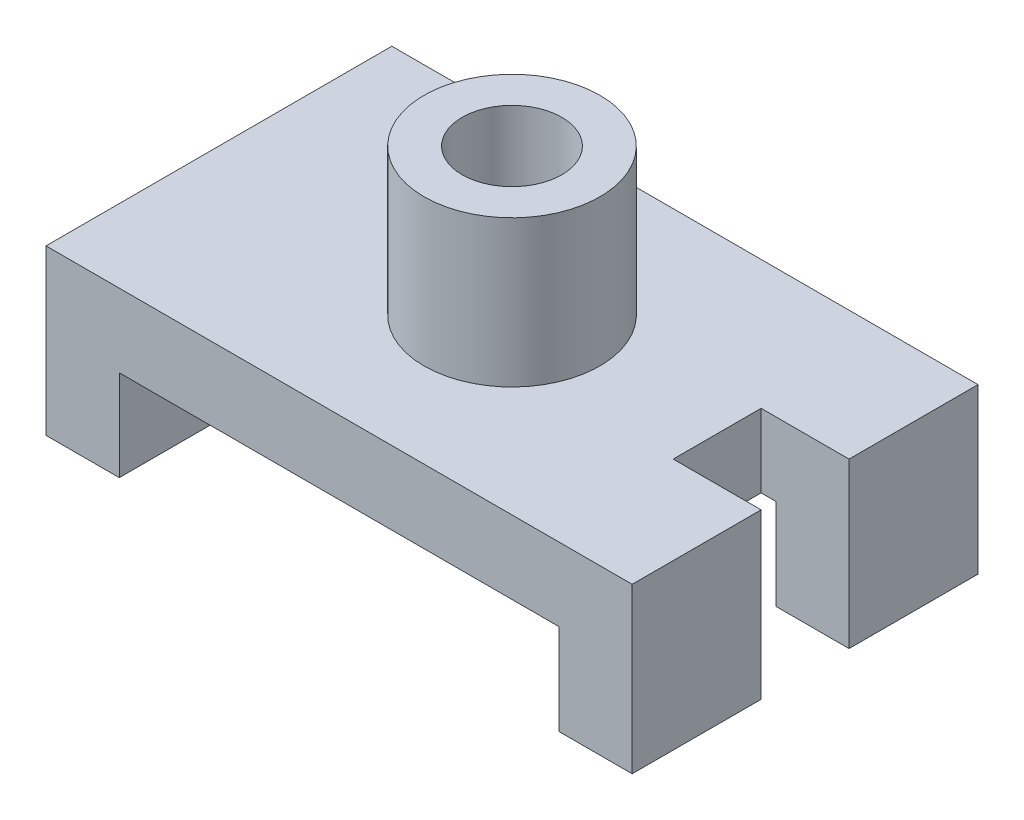
ISO-10303-21;
HEADER;
FILE_DESCRIPTION(('STEP AP214'),'2;1');
FILE_NAME('part.step','',(''),(''),'','','');
FILE_SCHEMA(('AUTOMOTIVE_DESIGN { 1 0 10303 214 1 1 1 1 }'));
ENDSEC;
DATA;
#1=APPLICATION_CONTEXT('core data for automotive mechanical design processes');
#2=APPLICATION_PROTOCOL_DEFINITION('international standard','automotive_design',2000,#1);
#3=PRODUCT_CONTEXT('',#1,'mechanical');
#4=PRODUCT('Part','Part','',(#3));
#5=PRODUCT_RELATED_PRODUCT_CATEGORY('part','',(#4));
#6=PRODUCT_DEFINITION_FORMATION('','',#4);
#7=PRODUCT_DEFINITION_CONTEXT('part definition',#1,'design');
#8=PRODUCT_DEFINITION('design','',#6,#7);
#9=PRODUCT_DEFINITION_SHAPE('','',#8);
#10=(LENGTH_UNIT() NAMED_UNIT(*) SI_UNIT(.MILLI.,.METRE.));
#11=(NAMED_UNIT(*) PLANE_ANGLE_UNIT() SI_UNIT($,.RADIAN.));
#12=(NAMED_UNIT(*) SI_UNIT($,.STERADIAN.) SOLID_ANGLE_UNIT());
#13=UNCERTAINTY_MEASURE_WITH_UNIT(LENGTH_MEASURE(1.E-05),#10,'distance_accuracy_value','');
#14=(GEOMETRIC_REPRESENTATION_CONTEXT(3) GLOBAL_UNCERTAINTY_ASSIGNED_CONTEXT((#13)) GLOBAL_UNIT_ASSIGNED_CONTEXT((#10,
#11,#12)) REPRESENTATION_CONTEXT('',''));
#15=CARTESIAN_POINT('',(0.,0.,0.));
#16=DIRECTION('',(0.,0.,1.));
#17=DIRECTION('',(1.,0.,0.));
#18=AXIS2_PLACEMENT_3D('',#15,#16,#17);
#19=CARTESIAN_POINT('',(0.,0.,1.18));
#20=DIRECTION('',(-1.,0.,0.));
#21=DIRECTION('',(0.,0.,1.));
#22=AXIS2_PLACEMENT_3D('',#19,#20,#21);
#23=PLANE('',#22);
#24=DIRECTION('',(0.,0.,-1.));
#25=VECTOR('',#24,1.);
#26=CARTESIAN_POINT('',(0.,0.,1.18));
#27=LINE('',#26,#25);
#28=CARTESIAN_POINT('',(0.,0.,1.18));
#29=VERTEX_POINT('',#28);
#30=CARTESIAN_POINT('',(0.,0.,0.3));
#31=VERTEX_POINT('',#30);
#32=EDGE_CURVE('E168',#29,#31,#27,.T.);
#33=ORIENTED_EDGE('',*,*,#32,.T.);
#34=DIRECTION('',(0.,1.,0.));
#35=VECTOR('',#34,1.);
#36=CARTESIAN_POINT('',(0.,0.,0.3));
#37=LINE('',#36,#35);
#38=CARTESIAN_POINT('',(0.,1.12,0.3));
#39=VERTEX_POINT('',#38);
#40=EDGE_CURVE('E217',#31,#39,#37,.T.);
#41=ORIENTED_EDGE('',*,*,#40,.T.);
#42=DIRECTION('',(0.,0.,-1.));
#43=VECTOR('',#42,1.);
#44=CARTESIAN_POINT('',(0.,1.12,1.18));
#45=LINE('',#44,#43);
#46=CARTESIAN_POINT('',(0.,1.12,1.18));
#47=VERTEX_POINT('',#46);
#48=EDGE_CURVE('E184',#47,#39,#45,.T.);
#49=ORIENTED_EDGE('',*,*,#48,.F.);
#50=DIRECTION('',(0.,1.,0.));
#51=VECTOR('',#50,1.);
#52=CARTESIAN_POINT('',(0.,0.,1.18));
#53=LINE('',#52,#51);
#54=EDGE_CURVE('E167',#29,#47,#53,.T.);
#55=ORIENTED_EDGE('',*,*,#54,.F.);
#56=EDGE_LOOP('',(#33,#41,#49,#55));
#57=FACE_BOUND('',#56,.T.);
#58=ADVANCED_FACE('F36',(#57),#23,.F.);
#59=CARTESIAN_POINT('',(-0.5,0.,1.18));
#60=DIRECTION('',(1.,0.,0.));
#61=DIRECTION('',(0.,1.,0.));
#62=AXIS2_PLACEMENT_3D('',#59,#60,#61);
#63=PLANE('',#62);
#64=DIRECTION('',(0.,0.,-1.));
#65=VECTOR('',#64,1.);
#66=CARTESIAN_POINT('',(-0.5,0.62,1.18));
#67=LINE('',#66,#65);
#68=CARTESIAN_POINT('',(-0.5,0.62,1.18));
#69=VERTEX_POINT('',#68);
#70=CARTESIAN_POINT('',(-0.5,0.62,0.3));
#71=VERTEX_POINT('',#70);
#72=EDGE_CURVE('E132',#69,#71,#67,.T.);
#73=ORIENTED_EDGE('',*,*,#72,.T.);
#74=DIRECTION('',(0.,-1.,0.));
#75=VECTOR('',#74,1.);
#76=CARTESIAN_POINT('',(-0.5,0.,0.3));
#77=LINE('',#76,#75);
#78=CARTESIAN_POINT('',(-0.5,0.,0.3));
#79=VERTEX_POINT('',#78);
#80=EDGE_CURVE('E225',#71,#79,#77,.T.);
#81=ORIENTED_EDGE('',*,*,#80,.T.);
#82=DIRECTION('',(0.,0.,-1.));
#83=VECTOR('',#82,1.);
#84=CARTESIAN_POINT('',(-0.5,0.,1.18));
#85=LINE('',#84,#83);
#86=CARTESIAN_POINT('',(-0.5,0.,1.18));
#87=VERTEX_POINT('',#86);
#88=EDGE_CURVE('E144',#87,#79,#85,.T.);
#89=ORIENTED_EDGE('',*,*,#88,.F.);
#90=DIRECTION('',(0.,-1.,0.));
#91=VECTOR('',#90,1.);
#92=CARTESIAN_POINT('',(-0.5,0.,1.18));
#93=LINE('',#92,#91);
#94=EDGE_CURVE('E122',#69,#87,#93,.T.);
#95=ORIENTED_EDGE('',*,*,#94,.F.);
#96=EDGE_LOOP('',(#73,#81,#89,#95));
#97=FACE_BOUND('',#96,.T.);
#98=ADVANCED_FACE('F142',(#97),#63,.F.);
#99=CARTESIAN_POINT('',(0.,0.,1.18));
#100=DIRECTION('',(0.,1.,0.));
#101=DIRECTION('',(0.,0.,1.));
#102=AXIS2_PLACEMENT_3D('',#99,#100,#101);
#103=PLANE('',#102);
#104=ORIENTED_EDGE('',*,*,#88,.T.);
#105=DIRECTION('',(1.,0.,0.));
#106=VECTOR('',#105,1.);
#107=CARTESIAN_POINT('',(0.,0.,0.3));
#108=LINE('',#107,#106);
#109=EDGE_CURVE('E186',#79,#31,#108,.T.);
#110=ORIENTED_EDGE('',*,*,#109,.T.);
#111=ORIENTED_EDGE('',*,*,#32,.F.);
#112=DIRECTION('',(1.,0.,0.));
#113=VECTOR('',#112,1.);
#114=CARTESIAN_POINT('',(0.,0.,1.18));
#115=LINE('',#114,#113);
#116=EDGE_CURVE('E60',#87,#29,#115,.T.);
#117=ORIENTED_EDGE('',*,*,#116,.F.);
#118=EDGE_LOOP('',(#104,#110,#111,#117));
#119=FACE_BOUND('',#118,.T.);
#120=ADVANCED_FACE('F260',(#119),#103,.F.);
#121=CARTESIAN_POINT('',(0.,1.12,-0.3));
#122=VERTEX_POINT('',#121);
#123=CARTESIAN_POINT('',(0.,1.12,-1.18));
#124=VERTEX_POINT('',#123);
#125=EDGE_CURVE('E183',#122,#124,#45,.T.);
#126=ORIENTED_EDGE('',*,*,#125,.F.);
#127=DIRECTION('',(0.,1.,0.));
#128=VECTOR('',#127,1.);
#129=CARTESIAN_POINT('',(0.,0.,-0.3));
#130=LINE('',#129,#128);
#131=CARTESIAN_POINT('',(0.,0.,-0.3));
#132=VERTEX_POINT('',#131);
#133=EDGE_CURVE('E215',#132,#122,#130,.T.);
#134=ORIENTED_EDGE('',*,*,#133,.F.);
#135=CARTESIAN_POINT('',(0.,0.,-1.18));
#136=VERTEX_POINT('',#135);
#137=EDGE_CURVE('E94',#132,#136,#27,.T.);
#138=ORIENTED_EDGE('',*,*,#137,.T.);
#139=DIRECTION('',(0.,1.,0.));
#140=VECTOR('',#139,1.);
#141=CARTESIAN_POINT('',(0.,0.,-1.18));
#142=LINE('',#141,#140);
#143=EDGE_CURVE('E149',#136,#124,#142,.T.);
#144=ORIENTED_EDGE('',*,*,#143,.T.);
#145=EDGE_LOOP('',(#126,#134,#138,#144));
#146=FACE_BOUND('',#145,.T.);
#147=ADVANCED_FACE('F38',(#146),#23,.F.);
#148=CARTESIAN_POINT('',(0.,1.12,1.18));
#149=DIRECTION('',(0.,-1.,0.));
#150=DIRECTION('',(0.,0.,-1.));
#151=AXIS2_PLACEMENT_3D('',#148,#149,#150);
#152=PLANE('',#151);
#153=CARTESIAN_POINT('',(-2.,1.12,0.));
#154=DIRECTION('',(0.,-1.,0.));
#155=DIRECTION('',(0.,0.,-1.));
#156=AXIS2_PLACEMENT_3D('',#153,#154,#155);
#157=CIRCLE('',#156,0.6);
#158=CARTESIAN_POINT('',(-2.,1.12,-0.6));
#159=VERTEX_POINT('',#158);
#160=EDGE_CURVE('E11',#159,#159,#157,.F.);
#161=ORIENTED_EDGE('',*,*,#160,.F.);
#162=EDGE_LOOP('',(#161));
#163=FACE_BOUND('',#162,.T.);
#164=ORIENTED_EDGE('',*,*,#48,.T.);
#165=DIRECTION('',(1.,0.,0.));
#166=VECTOR('',#165,1.);
#167=CARTESIAN_POINT('',(0.,1.12,0.3));
#168=LINE('',#167,#166);
#169=CARTESIAN_POINT('',(-0.6,1.12,0.3));
#170=VERTEX_POINT('',#169);
#171=EDGE_CURVE('E278',#170,#39,#168,.T.);
#172=ORIENTED_EDGE('',*,*,#171,.F.);
#173=DIRECTION('',(0.,0.,1.));
#174=VECTOR('',#173,1.);
#175=CARTESIAN_POINT('',(-0.6,1.12,-0.3));
#176=LINE('',#175,#174);
#177=CARTESIAN_POINT('',(-0.6,1.12,-0.3));
#178=VERTEX_POINT('',#177);
#179=EDGE_CURVE('E275',#178,#170,#176,.T.);
#180=ORIENTED_EDGE('',*,*,#179,.F.);
#181=DIRECTION('',(-1.,0.,0.));
#182=VECTOR('',#181,1.);
#183=CARTESIAN_POINT('',(0.,1.12,-0.3));
#184=LINE('',#183,#182);
#185=EDGE_CURVE('E213',#122,#178,#184,.T.);
#186=ORIENTED_EDGE('',*,*,#185,.F.);
#187=ORIENTED_EDGE('',*,*,#125,.T.);
#188=DIRECTION('',(-1.,0.,0.));
#189=VECTOR('',#188,1.);
#190=CARTESIAN_POINT('',(0.,1.12,-1.18));
#191=LINE('',#190,#189);
#192=CARTESIAN_POINT('',(-4.,1.12,-1.18));
#193=VERTEX_POINT('',#192);
#194=EDGE_CURVE('E151',#124,#193,#191,.T.);
#195=ORIENTED_EDGE('',*,*,#194,.T.);
#196=DIRECTION('',(0.,0.,-1.));
#197=VECTOR('',#196,1.);
#198=CARTESIAN_POINT('',(-4.,1.12,1.18));
#199=LINE('',#198,#197);
#200=CARTESIAN_POINT('',(-4.,1.12,1.18));
#201=VERTEX_POINT('',#200);
#202=EDGE_CURVE('E180',#201,#193,#199,.T.);
#203=ORIENTED_EDGE('',*,*,#202,.F.);
#204=DIRECTION('',(-1.,0.,0.));
#205=VECTOR('',#204,1.);
#206=CARTESIAN_POINT('',(0.,1.12,1.18));
#207=LINE('',#206,#205);
#208=EDGE_CURVE('E103',#47,#201,#207,.T.);
#209=ORIENTED_EDGE('',*,*,#208,.F.);
#210=EDGE_LOOP('',(#164,#172,#180,#186,#187,#195,#203,#209));
#211=FACE_BOUND('',#210,.T.);
#212=ADVANCED_FACE('F265',(#163,#211),#152,.F.);
#213=CARTESIAN_POINT('',(-4.,0.,1.18));
#214=DIRECTION('',(1.,0.,0.));
#215=DIRECTION('',(0.,0.,-1.));
#216=AXIS2_PLACEMENT_3D('',#213,#214,#215);
#217=PLANE('',#216);
#218=DIRECTION('',(0.,-1.,0.));
#219=VECTOR('',#218,1.);
#220=CARTESIAN_POINT('',(-4.,0.,-1.18));
#221=LINE('',#220,#219);
#222=CARTESIAN_POINT('',(-4.,0.,-1.18));
#223=VERTEX_POINT('',#222);
#224=EDGE_CURVE('E153',#193,#223,#221,.T.);
#225=ORIENTED_EDGE('',*,*,#224,.T.);
#226=DIRECTION('',(0.,0.,-1.));
#227=VECTOR('',#226,1.);
#228=CARTESIAN_POINT('',(-4.,0.,1.18));
#229=LINE('',#228,#227);
#230=CARTESIAN_POINT('',(-4.,0.,1.18));
#231=VERTEX_POINT('',#230);
#232=EDGE_CURVE('E177',#231,#223,#229,.T.);
#233=ORIENTED_EDGE('',*,*,#232,.F.);
#234=DIRECTION('',(0.,-1.,0.));
#235=VECTOR('',#234,1.);
#236=CARTESIAN_POINT('',(-4.,0.,1.18));
#237=LINE('',#236,#235);
#238=EDGE_CURVE('E230',#201,#231,#237,.T.);
#239=ORIENTED_EDGE('',*,*,#238,.F.);
#240=ORIENTED_EDGE('',*,*,#202,.T.);
#241=EDGE_LOOP('',(#225,#233,#239,#240));
#242=FACE_BOUND('',#241,.T.);
#243=ADVANCED_FACE('F269',(#242),#217,.F.);
#244=CARTESIAN_POINT('',(-3.5,0.,1.18));
#245=DIRECTION('',(0.,1.,0.));
#246=DIRECTION('',(0.,0.,1.));
#247=AXIS2_PLACEMENT_3D('',#244,#245,#246);
#248=PLANE('',#247);
#249=DIRECTION('',(1.,0.,0.));
#250=VECTOR('',#249,1.);
#251=CARTESIAN_POINT('',(-3.5,0.,-1.18));
#252=LINE('',#251,#250);
#253=CARTESIAN_POINT('',(-3.5,0.,-1.18));
#254=VERTEX_POINT('',#253);
#255=EDGE_CURVE('E155',#223,#254,#252,.T.);
#256=ORIENTED_EDGE('',*,*,#255,.T.);
#257=DIRECTION('',(0.,0.,-1.));
#258=VECTOR('',#257,1.);
#259=CARTESIAN_POINT('',(-3.5,0.,1.18));
#260=LINE('',#259,#258);
#261=CARTESIAN_POINT('',(-3.5,0.,1.18));
#262=VERTEX_POINT('',#261);
#263=EDGE_CURVE('E174',#262,#254,#260,.T.);
#264=ORIENTED_EDGE('',*,*,#263,.F.);
#265=DIRECTION('',(1.,0.,0.));
#266=VECTOR('',#265,1.);
#267=CARTESIAN_POINT('',(-3.5,0.,1.18));
#268=LINE('',#267,#266);
#269=EDGE_CURVE('E232',#231,#262,#268,.T.);
#270=ORIENTED_EDGE('',*,*,#269,.F.);
#271=ORIENTED_EDGE('',*,*,#232,.T.);
#272=EDGE_LOOP('',(#256,#264,#270,#271));
#273=FACE_BOUND('',#272,.T.);
#274=ADVANCED_FACE('F238',(#273),#248,.F.);
#275=CARTESIAN_POINT('',(-3.5,0.,1.18));
#276=DIRECTION('',(-1.,0.,0.));
#277=DIRECTION('',(0.,0.,1.));
#278=AXIS2_PLACEMENT_3D('',#275,#276,#277);
#279=PLANE('',#278);
#280=DIRECTION('',(0.,1.,0.));
#281=VECTOR('',#280,1.);
#282=CARTESIAN_POINT('',(-3.5,0.,-1.18));
#283=LINE('',#282,#281);
#284=CARTESIAN_POINT('',(-3.5,0.62,-1.18));
#285=VERTEX_POINT('',#284);
#286=EDGE_CURVE('E157',#254,#285,#283,.T.);
#287=ORIENTED_EDGE('',*,*,#286,.T.);
#288=DIRECTION('',(0.,0.,-1.));
#289=VECTOR('',#288,1.);
#290=CARTESIAN_POINT('',(-3.5,0.62,1.18));
#291=LINE('',#290,#289);
#292=CARTESIAN_POINT('',(-3.5,0.62,1.18));
#293=VERTEX_POINT('',#292);
#294=EDGE_CURVE('E139',#293,#285,#291,.T.);
#295=ORIENTED_EDGE('',*,*,#294,.F.);
#296=DIRECTION('',(0.,1.,0.));
#297=VECTOR('',#296,1.);
#298=CARTESIAN_POINT('',(-3.5,0.,1.18));
#299=LINE('',#298,#297);
#300=EDGE_CURVE('E125',#262,#293,#299,.T.);
#301=ORIENTED_EDGE('',*,*,#300,.F.);
#302=ORIENTED_EDGE('',*,*,#263,.T.);
#303=EDGE_LOOP('',(#287,#295,#301,#302));
#304=FACE_BOUND('',#303,.T.);
#305=ADVANCED_FACE('F242',(#304),#279,.F.);
#306=CARTESIAN_POINT('',(-3.5,0.62,1.18));
#307=DIRECTION('',(0.,1.,0.));
#308=DIRECTION('',(0.,0.,1.));
#309=AXIS2_PLACEMENT_3D('',#306,#307,#308);
#310=PLANE('',#309);
#311=DIRECTION('',(0.,0.,1.));
#312=VECTOR('',#311,1.);
#313=CARTESIAN_POINT('',(-0.6,0.62,1.18));
#314=LINE('',#313,#312);
#315=CARTESIAN_POINT('',(-0.6,0.62,-0.3));
#316=VERTEX_POINT('',#315);
#317=CARTESIAN_POINT('',(-0.6,0.62,0.3));
#318=VERTEX_POINT('',#317);
#319=EDGE_CURVE('E44',#316,#318,#314,.T.);
#320=ORIENTED_EDGE('',*,*,#319,.T.);
#321=DIRECTION('',(1.,0.,0.));
#322=VECTOR('',#321,1.);
#323=CARTESIAN_POINT('',(-3.5,0.62,0.3));
#324=LINE('',#323,#322);
#325=EDGE_CURVE('E136',#318,#71,#324,.T.);
#326=ORIENTED_EDGE('',*,*,#325,.T.);
#327=ORIENTED_EDGE('',*,*,#72,.F.);
#328=DIRECTION('',(1.,0.,0.));
#329=VECTOR('',#328,1.);
#330=CARTESIAN_POINT('',(-3.5,0.62,1.18));
#331=LINE('',#330,#329);
#332=EDGE_CURVE('E118',#293,#69,#331,.T.);
#333=ORIENTED_EDGE('',*,*,#332,.F.);
#334=ORIENTED_EDGE('',*,*,#294,.T.);
#335=DIRECTION('',(1.,0.,0.));
#336=VECTOR('',#335,1.);
#337=CARTESIAN_POINT('',(-3.5,0.62,-1.18));
#338=LINE('',#337,#336);
#339=CARTESIAN_POINT('',(-0.5,0.62,-1.18));
#340=VERTEX_POINT('',#339);
#341=EDGE_CURVE('E159',#285,#340,#338,.T.);
#342=ORIENTED_EDGE('',*,*,#341,.T.);
#343=CARTESIAN_POINT('',(-0.5,0.62,-0.3));
#344=VERTEX_POINT('',#343);
#345=EDGE_CURVE('E140',#344,#340,#67,.T.);
#346=ORIENTED_EDGE('',*,*,#345,.F.);
#347=DIRECTION('',(-1.,0.,0.));
#348=VECTOR('',#347,1.);
#349=CARTESIAN_POINT('',(-3.5,0.62,-0.3));
#350=LINE('',#349,#348);
#351=EDGE_CURVE('E193',#344,#316,#350,.T.);
#352=ORIENTED_EDGE('',*,*,#351,.T.);
#353=EDGE_LOOP('',(#320,#326,#327,#333,#334,#342,#346,#352));
#354=FACE_BOUND('',#353,.T.);
#355=ADVANCED_FACE('F134',(#354),#310,.F.);
#356=CARTESIAN_POINT('',(-0.5,0.,-0.3));
#357=VERTEX_POINT('',#356);
#358=CARTESIAN_POINT('',(-0.5,0.,-1.18));
#359=VERTEX_POINT('',#358);
#360=EDGE_CURVE('E171',#357,#359,#85,.T.);
#361=ORIENTED_EDGE('',*,*,#360,.F.);
#362=DIRECTION('',(0.,1.,0.));
#363=VECTOR('',#362,1.);
#364=CARTESIAN_POINT('',(-0.5,0.,-0.3));
#365=LINE('',#364,#363);
#366=EDGE_CURVE('E51',#357,#344,#365,.T.);
#367=ORIENTED_EDGE('',*,*,#366,.T.);
#368=ORIENTED_EDGE('',*,*,#345,.T.);
#369=DIRECTION('',(0.,-1.,0.));
#370=VECTOR('',#369,1.);
#371=CARTESIAN_POINT('',(-0.5,0.,-1.18));
#372=LINE('',#371,#370);
#373=EDGE_CURVE('E162',#340,#359,#372,.T.);
#374=ORIENTED_EDGE('',*,*,#373,.T.);
#375=EDGE_LOOP('',(#361,#367,#368,#374));
#376=FACE_BOUND('',#375,.T.);
#377=ADVANCED_FACE('F251',(#376),#63,.F.);
#378=ORIENTED_EDGE('',*,*,#137,.F.);
#379=DIRECTION('',(-1.,0.,0.));
#380=VECTOR('',#379,1.);
#381=CARTESIAN_POINT('',(0.,0.,-0.3));
#382=LINE('',#381,#380);
#383=EDGE_CURVE('E219',#132,#357,#382,.T.);
#384=ORIENTED_EDGE('',*,*,#383,.T.);
#385=ORIENTED_EDGE('',*,*,#360,.T.);
#386=DIRECTION('',(1.,0.,0.));
#387=VECTOR('',#386,1.);
#388=CARTESIAN_POINT('',(0.,0.,-1.18));
#389=LINE('',#388,#387);
#390=EDGE_CURVE('E165',#359,#136,#389,.T.);
#391=ORIENTED_EDGE('',*,*,#390,.T.);
#392=EDGE_LOOP('',(#378,#384,#385,#391));
#393=FACE_BOUND('',#392,.T.);
#394=ADVANCED_FACE('F293',(#393),#103,.F.);
#395=CARTESIAN_POINT('',(0.,0.,1.18));
#396=DIRECTION('',(0.,0.,1.));
#397=DIRECTION('',(1.,0.,0.));
#398=AXIS2_PLACEMENT_3D('',#395,#396,#397);
#399=PLANE('',#398);
#400=ORIENTED_EDGE('',*,*,#54,.T.);
#401=ORIENTED_EDGE('',*,*,#208,.T.);
#402=ORIENTED_EDGE('',*,*,#238,.T.);
#403=ORIENTED_EDGE('',*,*,#269,.T.);
#404=ORIENTED_EDGE('',*,*,#300,.T.);
#405=ORIENTED_EDGE('',*,*,#332,.T.);
#406=ORIENTED_EDGE('',*,*,#94,.T.);
#407=ORIENTED_EDGE('',*,*,#116,.T.);
#408=EDGE_LOOP('',(#400,#401,#402,#403,#404,#405,#406,#407));
#409=FACE_BOUND('',#408,.T.);
#410=ADVANCED_FACE('F120',(#409),#399,.T.);
#411=CARTESIAN_POINT('',(0.,0.,-1.18));
#412=DIRECTION('',(0.,0.,1.));
#413=DIRECTION('',(1.,0.,0.));
#414=AXIS2_PLACEMENT_3D('',#411,#412,#413);
#415=PLANE('',#414);
#416=ORIENTED_EDGE('',*,*,#143,.F.);
#417=ORIENTED_EDGE('',*,*,#390,.F.);
#418=ORIENTED_EDGE('',*,*,#373,.F.);
#419=ORIENTED_EDGE('',*,*,#341,.F.);
#420=ORIENTED_EDGE('',*,*,#286,.F.);
#421=ORIENTED_EDGE('',*,*,#255,.F.);
#422=ORIENTED_EDGE('',*,*,#224,.F.);
#423=ORIENTED_EDGE('',*,*,#194,.F.);
#424=EDGE_LOOP('',(#416,#417,#418,#419,#420,#421,#422,#423));
#425=FACE_BOUND('',#424,.T.);
#426=ADVANCED_FACE('F247',(#425),#415,.F.);
#427=CARTESIAN_POINT('',(-0.6,0.,-0.3));
#428=DIRECTION('',(-1.,0.,0.));
#429=DIRECTION('',(0.,0.,1.));
#430=AXIS2_PLACEMENT_3D('',#427,#428,#429);
#431=PLANE('',#430);
#432=DIRECTION('',(0.,1.,0.));
#433=VECTOR('',#432,1.);
#434=CARTESIAN_POINT('',(-0.6,0.,-0.3));
#435=LINE('',#434,#433);
#436=EDGE_CURVE('E204',#316,#178,#435,.T.);
#437=ORIENTED_EDGE('',*,*,#436,.T.);
#438=ORIENTED_EDGE('',*,*,#179,.T.);
#439=DIRECTION('',(0.,1.,0.));
#440=VECTOR('',#439,1.);
#441=CARTESIAN_POINT('',(-0.6,0.,0.3));
#442=LINE('',#441,#440);
#443=EDGE_CURVE('E207',#318,#170,#442,.T.);
#444=ORIENTED_EDGE('',*,*,#443,.F.);
#445=ORIENTED_EDGE('',*,*,#319,.F.);
#446=EDGE_LOOP('',(#437,#438,#444,#445));
#447=FACE_BOUND('',#446,.T.);
#448=ADVANCED_FACE('F201',(#447),#431,.F.);
#449=CARTESIAN_POINT('',(0.,0.,0.3));
#450=DIRECTION('',(0.,0.,1.));
#451=DIRECTION('',(1.,0.,0.));
#452=AXIS2_PLACEMENT_3D('',#449,#450,#451);
#453=PLANE('',#452);
#454=ORIENTED_EDGE('',*,*,#443,.T.);
#455=ORIENTED_EDGE('',*,*,#171,.T.);
#456=ORIENTED_EDGE('',*,*,#40,.F.);
#457=ORIENTED_EDGE('',*,*,#109,.F.);
#458=ORIENTED_EDGE('',*,*,#80,.F.);
#459=ORIENTED_EDGE('',*,*,#325,.F.);
#460=EDGE_LOOP('',(#454,#455,#456,#457,#458,#459));
#461=FACE_BOUND('',#460,.T.);
#462=ADVANCED_FACE('F258',(#461),#453,.F.);
#463=CARTESIAN_POINT('',(0.,0.,-0.3));
#464=DIRECTION('',(0.,0.,-1.));
#465=DIRECTION('',(-1.,0.,0.));
#466=AXIS2_PLACEMENT_3D('',#463,#464,#465);
#467=PLANE('',#466);
#468=ORIENTED_EDGE('',*,*,#366,.F.);
#469=ORIENTED_EDGE('',*,*,#383,.F.);
#470=ORIENTED_EDGE('',*,*,#133,.T.);
#471=ORIENTED_EDGE('',*,*,#185,.T.);
#472=ORIENTED_EDGE('',*,*,#436,.F.);
#473=ORIENTED_EDGE('',*,*,#351,.F.);
#474=EDGE_LOOP('',(#468,#469,#470,#471,#472,#473));
#475=FACE_BOUND('',#474,.T.);
#476=ADVANCED_FACE('F210',(#475),#467,.F.);
#477=CARTESIAN_POINT('',(-2.,2.12,0.));
#478=DIRECTION('',(0.,1.,0.));
#479=DIRECTION('',(0.,0.,1.));
#480=AXIS2_PLACEMENT_3D('',#477,#478,#479);
#481=PLANE('',#480);
#482=CARTESIAN_POINT('',(-2.,2.12,0.));
#483=DIRECTION('',(0.,1.,0.));
#484=DIRECTION('',(0.,0.,1.));
#485=AXIS2_PLACEMENT_3D('',#482,#483,#484);
#486=CIRCLE('',#485,0.6);
#487=CARTESIAN_POINT('',(-2.,2.12,0.6));
#488=VERTEX_POINT('',#487);
#489=EDGE_CURVE('E276',#488,#488,#486,.T.);
#490=ORIENTED_EDGE('',*,*,#489,.T.);
#491=EDGE_LOOP('',(#490));
#492=FACE_BOUND('',#491,.T.);
#493=CARTESIAN_POINT('',(-2.,2.12,0.));
#494=DIRECTION('',(0.,1.,0.));
#495=DIRECTION('',(0.,0.,1.));
#496=AXIS2_PLACEMENT_3D('',#493,#494,#495);
#497=CIRCLE('',#496,0.34);
#498=CARTESIAN_POINT('',(-2.,2.12,0.34));
#499=VERTEX_POINT('',#498);
#500=EDGE_CURVE('E281',#499,#499,#497,.T.);
#501=ORIENTED_EDGE('',*,*,#500,.F.);
#502=EDGE_LOOP('',(#501));
#503=FACE_BOUND('',#502,.T.);
#504=ADVANCED_FACE('F337',(#492,#503),#481,.T.);
#505=CARTESIAN_POINT('',(-2.,2.12,0.));
#506=DIRECTION('',(0.,-1.,0.));
#507=DIRECTION('',(0.,0.,-1.));
#508=AXIS2_PLACEMENT_3D('',#505,#506,#507);
#509=CYLINDRICAL_SURFACE('',#508,0.6);
#510=ORIENTED_EDGE('',*,*,#489,.F.);
#511=EDGE_LOOP('',(#510));
#512=FACE_BOUND('',#511,.T.);
#513=ORIENTED_EDGE('',*,*,#160,.T.);
#514=EDGE_LOOP('',(#513));
#515=FACE_BOUND('',#514,.T.);
#516=ADVANCED_FACE('F325',(#512,#515),#509,.T.);
#517=CARTESIAN_POINT('',(-2.,2.12,0.));
#518=DIRECTION('',(0.,-1.,0.));
#519=DIRECTION('',(0.,0.,-1.));
#520=AXIS2_PLACEMENT_3D('',#517,#518,#519);
#521=CYLINDRICAL_SURFACE('',#520,0.34);
#522=ORIENTED_EDGE('',*,*,#500,.T.);
#523=EDGE_LOOP('',(#522));
#524=FACE_BOUND('',#523,.T.);
#525=CARTESIAN_POINT('',(-2.,1.12,0.));
#526=DIRECTION('',(0.,1.,0.));
#527=DIRECTION('',(0.,0.,1.));
#528=AXIS2_PLACEMENT_3D('',#525,#526,#527);
#529=CIRCLE('',#528,0.34);
#530=CARTESIAN_POINT('',(-2.,1.12,0.34));
#531=VERTEX_POINT('',#530);
#532=EDGE_CURVE('E330',#531,#531,#529,.T.);
#533=ORIENTED_EDGE('',*,*,#532,.F.);
#534=EDGE_LOOP('',(#533));
#535=FACE_BOUND('',#534,.T.);
#536=ADVANCED_FACE('F320',(#524,#535),#521,.F.);
#537=ORIENTED_EDGE('',*,*,#532,.T.);
#538=EDGE_LOOP('',(#537));
#539=FACE_BOUND('',#538,.T.);
#540=ADVANCED_FACE('F313',(#539),#152,.F.);
#541=CLOSED_SHELL('',(#58,#98,#120,#147,#212,#243,#274,#305,#355,#377,#394,#410,#426,#448,#462,
#476,#504,#516,#536,#540));
#542=MANIFOLD_SOLID_BREP('B2',#541);
#543=ADVANCED_BREP_SHAPE_REPRESENTATION('',(#18,#542),#14);
#544=SHAPE_DEFINITION_REPRESENTATION(#9,#543);
ENDSEC;
END-ISO-10303-21;
